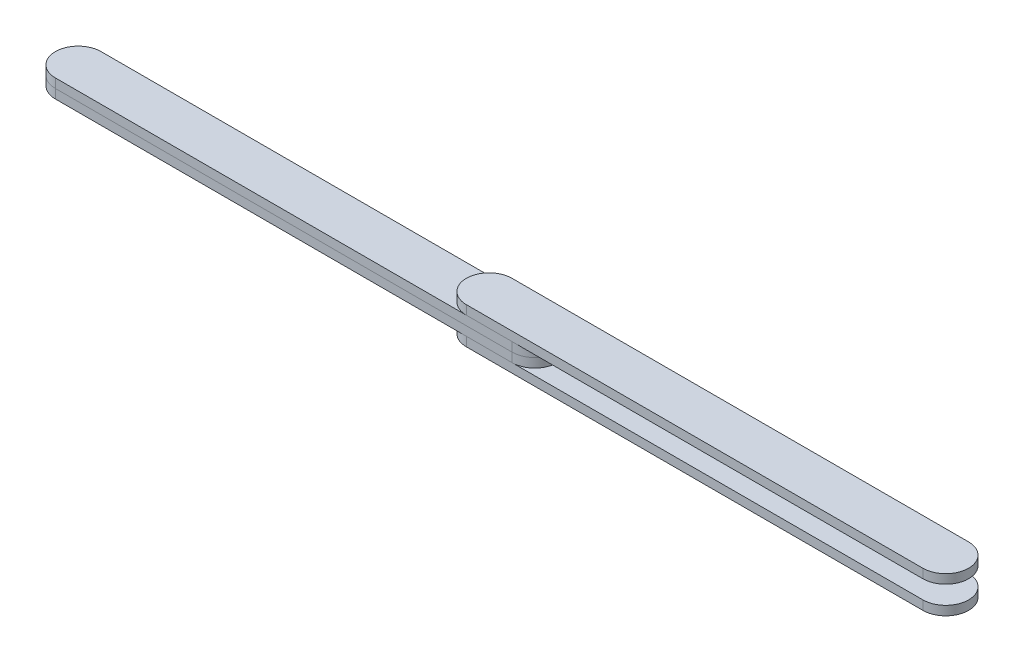
ISO-10303-21;
HEADER;
FILE_DESCRIPTION(('STEP AP214'),'2;1');
FILE_NAME('part.step','',(''),(''),'','','');
FILE_SCHEMA(('AUTOMOTIVE_DESIGN { 1 0 10303 214 1 1 1 1 }'));
ENDSEC;
DATA;
#1=APPLICATION_CONTEXT('core data for automotive mechanical design processes');
#2=APPLICATION_PROTOCOL_DEFINITION('international standard','automotive_design',2000,#1);
#3=PRODUCT_CONTEXT('',#1,'mechanical');
#4=PRODUCT('Part','Part','',(#3));
#5=PRODUCT_RELATED_PRODUCT_CATEGORY('part','',(#4));
#6=PRODUCT_DEFINITION_FORMATION('','',#4);
#7=PRODUCT_DEFINITION_CONTEXT('part definition',#1,'design');
#8=PRODUCT_DEFINITION('design','',#6,#7);
#9=PRODUCT_DEFINITION_SHAPE('','',#8);
#10=(LENGTH_UNIT() NAMED_UNIT(*) SI_UNIT(.MILLI.,.METRE.));
#11=(NAMED_UNIT(*) PLANE_ANGLE_UNIT() SI_UNIT($,.RADIAN.));
#12=(NAMED_UNIT(*) SI_UNIT($,.STERADIAN.) SOLID_ANGLE_UNIT());
#13=UNCERTAINTY_MEASURE_WITH_UNIT(LENGTH_MEASURE(1.E-05),#10,'distance_accuracy_value','');
#14=(GEOMETRIC_REPRESENTATION_CONTEXT(3) GLOBAL_UNCERTAINTY_ASSIGNED_CONTEXT((#13)) GLOBAL_UNIT_ASSIGNED_CONTEXT((#10,
#11,#12)) REPRESENTATION_CONTEXT('',''));
#15=CARTESIAN_POINT('',(0.,0.,0.));
#16=DIRECTION('',(0.,0.,1.));
#17=DIRECTION('',(1.,0.,0.));
#18=AXIS2_PLACEMENT_3D('',#15,#16,#17);
#19=CARTESIAN_POINT('',(970.077980765021,1026.37820884066,1015.54777221693));
#20=DIRECTION('',(0.,-1.,0.));
#21=DIRECTION('',(0.,0.,-1.));
#22=AXIS2_PLACEMENT_3D('',#19,#20,#21);
#23=CYLINDRICAL_SURFACE('',#22,5.);
#24=CARTESIAN_POINT('',(970.077980765021,1024.37820884066,1015.54777221693));
#25=DIRECTION('',(0.,1.,0.));
#26=DIRECTION('',(0.,0.,-1.));
#27=AXIS2_PLACEMENT_3D('',#24,#25,#26);
#28=CIRCLE('',#27,5.);
#29=CARTESIAN_POINT('',(970.077980765021,1024.37820884066,1010.54777221693));
#30=VERTEX_POINT('',#29);
#31=CARTESIAN_POINT('',(970.077980765021,1024.37820884066,1020.54777221693));
#32=VERTEX_POINT('',#31);
#33=EDGE_CURVE('P0_E79',#30,#32,#28,.T.);
#34=ORIENTED_EDGE('',*,*,#33,.T.);
#35=DIRECTION('',(0.,-1.,0.));
#36=VECTOR('',#35,1.);
#37=CARTESIAN_POINT('',(970.077980765021,1026.37820884066,1020.54777221693));
#38=LINE('',#37,#36);
#39=CARTESIAN_POINT('',(970.077980765021,1026.37820884066,1020.54777221693));
#40=VERTEX_POINT('',#39);
#41=EDGE_CURVE('P0_E10',#40,#32,#38,.T.);
#42=ORIENTED_EDGE('',*,*,#41,.F.);
#43=CARTESIAN_POINT('',(970.077980765021,1026.37820884066,1015.54777221693));
#44=DIRECTION('',(0.,1.,0.));
#45=DIRECTION('',(0.,0.,-1.));
#46=AXIS2_PLACEMENT_3D('',#43,#44,#45);
#47=CIRCLE('',#46,5.);
#48=CARTESIAN_POINT('',(970.077980765021,1026.37820884066,1010.54777221693));
#49=VERTEX_POINT('',#48);
#50=EDGE_CURVE('P0_E67',#49,#40,#47,.T.);
#51=ORIENTED_EDGE('',*,*,#50,.F.);
#52=DIRECTION('',(0.,-1.,0.));
#53=VECTOR('',#52,1.);
#54=CARTESIAN_POINT('',(970.077980765021,1026.37820884066,1010.54777221693));
#55=LINE('',#54,#53);
#56=EDGE_CURVE('P0_E75',#49,#30,#55,.T.);
#57=ORIENTED_EDGE('',*,*,#56,.T.);
#58=EDGE_LOOP('',(#34,#42,#51,#57));
#59=FACE_BOUND('',#58,.T.);
#60=ADVANCED_FACE('P0_F16',(#59),#23,.T.);
#61=CARTESIAN_POINT('',(970.077980765021,1026.37820884066,1020.54777221693));
#62=DIRECTION('',(0.,0.,-1.));
#63=DIRECTION('',(-1.,0.,0.));
#64=AXIS2_PLACEMENT_3D('',#61,#62,#63);
#65=PLANE('',#64);
#66=DIRECTION('',(1.,0.,0.));
#67=VECTOR('',#66,1.);
#68=CARTESIAN_POINT('',(970.077980765021,1024.37820884066,1020.54777221693));
#69=LINE('',#68,#67);
#70=CARTESIAN_POINT('',(1070.07798076502,1024.37820884066,1020.54777221693));
#71=VERTEX_POINT('',#70);
#72=EDGE_CURVE('P0_E71',#32,#71,#69,.T.);
#73=ORIENTED_EDGE('',*,*,#72,.T.);
#74=DIRECTION('',(0.,-1.,0.));
#75=VECTOR('',#74,1.);
#76=CARTESIAN_POINT('',(1070.07798076502,1026.37820884066,1020.54777221693));
#77=LINE('',#76,#75);
#78=CARTESIAN_POINT('',(1070.07798076502,1026.37820884066,1020.54777221693));
#79=VERTEX_POINT('',#78);
#80=EDGE_CURVE('P0_E24',#79,#71,#77,.T.);
#81=ORIENTED_EDGE('',*,*,#80,.F.);
#82=DIRECTION('',(1.,0.,0.));
#83=VECTOR('',#82,1.);
#84=CARTESIAN_POINT('',(970.077980765021,1026.37820884066,1020.54777221693));
#85=LINE('',#84,#83);
#86=EDGE_CURVE('P0_E62',#40,#79,#85,.T.);
#87=ORIENTED_EDGE('',*,*,#86,.F.);
#88=ORIENTED_EDGE('',*,*,#41,.T.);
#89=EDGE_LOOP('',(#73,#81,#87,#88));
#90=FACE_BOUND('',#89,.T.);
#91=ADVANCED_FACE('P0_F70',(#90),#65,.F.);
#92=CARTESIAN_POINT('',(1070.07798076502,1026.37820884066,1015.54777221693));
#93=DIRECTION('',(0.,-1.,0.));
#94=DIRECTION('',(0.,0.,-1.));
#95=AXIS2_PLACEMENT_3D('',#92,#93,#94);
#96=CYLINDRICAL_SURFACE('',#95,5.);
#97=CARTESIAN_POINT('',(1070.07798076502,1024.37820884066,1015.54777221693));
#98=DIRECTION('',(0.,1.,0.));
#99=DIRECTION('',(0.,0.,1.));
#100=AXIS2_PLACEMENT_3D('',#97,#98,#99);
#101=CIRCLE('',#100,5.);
#102=CARTESIAN_POINT('',(1070.07798076502,1024.37820884066,1010.54777221693));
#103=VERTEX_POINT('',#102);
#104=EDGE_CURVE('P0_E49',#71,#103,#101,.T.);
#105=ORIENTED_EDGE('',*,*,#104,.T.);
#106=DIRECTION('',(0.,-1.,0.));
#107=VECTOR('',#106,1.);
#108=CARTESIAN_POINT('',(1070.07798076502,1026.37820884066,1010.54777221693));
#109=LINE('',#108,#107);
#110=CARTESIAN_POINT('',(1070.07798076502,1026.37820884066,1010.54777221693));
#111=VERTEX_POINT('',#110);
#112=EDGE_CURVE('P0_E72',#111,#103,#109,.T.);
#113=ORIENTED_EDGE('',*,*,#112,.F.);
#114=CARTESIAN_POINT('',(1070.07798076502,1026.37820884066,1015.54777221693));
#115=DIRECTION('',(0.,1.,0.));
#116=DIRECTION('',(0.,0.,1.));
#117=AXIS2_PLACEMENT_3D('',#114,#115,#116);
#118=CIRCLE('',#117,5.);
#119=EDGE_CURVE('P0_E65',#79,#111,#118,.T.);
#120=ORIENTED_EDGE('',*,*,#119,.F.);
#121=ORIENTED_EDGE('',*,*,#80,.T.);
#122=EDGE_LOOP('',(#105,#113,#120,#121));
#123=FACE_BOUND('',#122,.T.);
#124=ADVANCED_FACE('P0_F73',(#123),#96,.T.);
#125=CARTESIAN_POINT('',(970.077980765021,1026.37820884066,1010.54777221693));
#126=DIRECTION('',(0.,0.,1.));
#127=DIRECTION('',(1.,0.,0.));
#128=AXIS2_PLACEMENT_3D('',#125,#126,#127);
#129=PLANE('',#128);
#130=DIRECTION('',(-1.,0.,0.));
#131=VECTOR('',#130,1.);
#132=CARTESIAN_POINT('',(970.077980765021,1024.37820884066,1010.54777221693));
#133=LINE('',#132,#131);
#134=EDGE_CURVE('P0_E55',#103,#30,#133,.T.);
#135=ORIENTED_EDGE('',*,*,#134,.T.);
#136=ORIENTED_EDGE('',*,*,#56,.F.);
#137=DIRECTION('',(-1.,0.,0.));
#138=VECTOR('',#137,1.);
#139=CARTESIAN_POINT('',(970.077980765021,1026.37820884066,1010.54777221693));
#140=LINE('',#139,#138);
#141=EDGE_CURVE('P0_E32',#111,#49,#140,.T.);
#142=ORIENTED_EDGE('',*,*,#141,.F.);
#143=ORIENTED_EDGE('',*,*,#112,.T.);
#144=EDGE_LOOP('',(#135,#136,#142,#143));
#145=FACE_BOUND('',#144,.T.);
#146=ADVANCED_FACE('P0_F86',(#145),#129,.F.);
#147=CARTESIAN_POINT('',(970.077980765021,1026.37820884066,1015.54777221693));
#148=DIRECTION('',(0.,-1.,0.));
#149=DIRECTION('',(0.,0.,-1.));
#150=AXIS2_PLACEMENT_3D('',#147,#148,#149);
#151=PLANE('',#150);
#152=ORIENTED_EDGE('',*,*,#50,.T.);
#153=ORIENTED_EDGE('',*,*,#86,.T.);
#154=ORIENTED_EDGE('',*,*,#119,.T.);
#155=ORIENTED_EDGE('',*,*,#141,.T.);
#156=EDGE_LOOP('',(#152,#153,#154,#155));
#157=FACE_BOUND('',#156,.T.);
#158=ADVANCED_FACE('P0_F63',(#157),#151,.F.);
#159=CARTESIAN_POINT('',(970.077980765021,1024.37820884066,1015.54777221693));
#160=DIRECTION('',(0.,-1.,0.));
#161=DIRECTION('',(0.,0.,-1.));
#162=AXIS2_PLACEMENT_3D('',#159,#160,#161);
#163=PLANE('',#162);
#164=ORIENTED_EDGE('',*,*,#33,.F.);
#165=ORIENTED_EDGE('',*,*,#134,.F.);
#166=ORIENTED_EDGE('',*,*,#104,.F.);
#167=ORIENTED_EDGE('',*,*,#72,.F.);
#168=EDGE_LOOP('',(#164,#165,#166,#167));
#169=FACE_BOUND('',#168,.T.);
#170=ADVANCED_FACE('P0_F89',(#169),#163,.T.);
#171=CLOSED_SHELL('',(#60,#91,#124,#146,#158,#170));
#172=MANIFOLD_SOLID_BREP('P0_B1',#171);
#173=CARTESIAN_POINT('',(970.077980765021,1028.37820884066,1015.54777221693));
#174=DIRECTION('',(0.,-1.,0.));
#175=DIRECTION('',(0.,0.,-1.));
#176=AXIS2_PLACEMENT_3D('',#173,#174,#175);
#177=CYLINDRICAL_SURFACE('',#176,5.);
#178=CARTESIAN_POINT('',(970.077980765021,1026.37820884066,1015.54777221693));
#179=DIRECTION('',(0.,1.,0.));
#180=DIRECTION('',(0.,0.,-1.));
#181=AXIS2_PLACEMENT_3D('',#178,#179,#180);
#182=CIRCLE('',#181,5.);
#183=CARTESIAN_POINT('',(970.077980765021,1026.37820884066,1010.54777221693));
#184=VERTEX_POINT('',#183);
#185=CARTESIAN_POINT('',(970.077980765021,1026.37820884066,1020.54777221693));
#186=VERTEX_POINT('',#185);
#187=EDGE_CURVE('P1_E80',#184,#186,#182,.T.);
#188=ORIENTED_EDGE('',*,*,#187,.T.);
#189=DIRECTION('',(0.,-1.,0.));
#190=VECTOR('',#189,1.);
#191=CARTESIAN_POINT('',(970.077980765021,1028.37820884066,1020.54777221693));
#192=LINE('',#191,#190);
#193=CARTESIAN_POINT('',(970.077980765021,1028.37820884066,1020.54777221693));
#194=VERTEX_POINT('',#193);
#195=EDGE_CURVE('P1_E11',#194,#186,#192,.T.);
#196=ORIENTED_EDGE('',*,*,#195,.F.);
#197=CARTESIAN_POINT('',(970.077980765021,1028.37820884066,1015.54777221693));
#198=DIRECTION('',(0.,1.,0.));
#199=DIRECTION('',(0.,0.,-1.));
#200=AXIS2_PLACEMENT_3D('',#197,#198,#199);
#201=CIRCLE('',#200,5.);
#202=CARTESIAN_POINT('',(970.077980765021,1028.37820884066,1010.54777221693));
#203=VERTEX_POINT('',#202);
#204=EDGE_CURVE('P1_E68',#203,#194,#201,.T.);
#205=ORIENTED_EDGE('',*,*,#204,.F.);
#206=DIRECTION('',(0.,-1.,0.));
#207=VECTOR('',#206,1.);
#208=CARTESIAN_POINT('',(970.077980765021,1028.37820884066,1010.54777221693));
#209=LINE('',#208,#207);
#210=EDGE_CURVE('P1_E76',#203,#184,#209,.T.);
#211=ORIENTED_EDGE('',*,*,#210,.T.);
#212=EDGE_LOOP('',(#188,#196,#205,#211));
#213=FACE_BOUND('',#212,.T.);
#214=ADVANCED_FACE('P1_F17',(#213),#177,.T.);
#215=CARTESIAN_POINT('',(970.077980765021,1028.37820884066,1020.54777221693));
#216=DIRECTION('',(0.,0.,-1.));
#217=DIRECTION('',(-1.,0.,0.));
#218=AXIS2_PLACEMENT_3D('',#215,#216,#217);
#219=PLANE('',#218);
#220=DIRECTION('',(1.,0.,0.));
#221=VECTOR('',#220,1.);
#222=CARTESIAN_POINT('',(970.077980765021,1026.37820884066,1020.54777221693));
#223=LINE('',#222,#221);
#224=CARTESIAN_POINT('',(1070.07798076502,1026.37820884066,1020.54777221693));
#225=VERTEX_POINT('',#224);
#226=EDGE_CURVE('P1_E72',#186,#225,#223,.T.);
#227=ORIENTED_EDGE('',*,*,#226,.T.);
#228=DIRECTION('',(0.,-1.,0.));
#229=VECTOR('',#228,1.);
#230=CARTESIAN_POINT('',(1070.07798076502,1028.37820884066,1020.54777221693));
#231=LINE('',#230,#229);
#232=CARTESIAN_POINT('',(1070.07798076502,1028.37820884066,1020.54777221693));
#233=VERTEX_POINT('',#232);
#234=EDGE_CURVE('P1_E25',#233,#225,#231,.T.);
#235=ORIENTED_EDGE('',*,*,#234,.F.);
#236=DIRECTION('',(1.,0.,0.));
#237=VECTOR('',#236,1.);
#238=CARTESIAN_POINT('',(970.077980765021,1028.37820884066,1020.54777221693));
#239=LINE('',#238,#237);
#240=EDGE_CURVE('P1_E63',#194,#233,#239,.T.);
#241=ORIENTED_EDGE('',*,*,#240,.F.);
#242=ORIENTED_EDGE('',*,*,#195,.T.);
#243=EDGE_LOOP('',(#227,#235,#241,#242));
#244=FACE_BOUND('',#243,.T.);
#245=ADVANCED_FACE('P1_F71',(#244),#219,.F.);
#246=CARTESIAN_POINT('',(1070.07798076502,1028.37820884066,1015.54777221693));
#247=DIRECTION('',(0.,-1.,0.));
#248=DIRECTION('',(0.,0.,-1.));
#249=AXIS2_PLACEMENT_3D('',#246,#247,#248);
#250=CYLINDRICAL_SURFACE('',#249,5.);
#251=CARTESIAN_POINT('',(1070.07798076502,1026.37820884066,1015.54777221693));
#252=DIRECTION('',(0.,1.,0.));
#253=DIRECTION('',(0.,0.,1.));
#254=AXIS2_PLACEMENT_3D('',#251,#252,#253);
#255=CIRCLE('',#254,5.);
#256=CARTESIAN_POINT('',(1070.07798076502,1026.37820884066,1010.54777221693));
#257=VERTEX_POINT('',#256);
#258=EDGE_CURVE('P1_E50',#225,#257,#255,.T.);
#259=ORIENTED_EDGE('',*,*,#258,.T.);
#260=DIRECTION('',(0.,-1.,0.));
#261=VECTOR('',#260,1.);
#262=CARTESIAN_POINT('',(1070.07798076502,1028.37820884066,1010.54777221693));
#263=LINE('',#262,#261);
#264=CARTESIAN_POINT('',(1070.07798076502,1028.37820884066,1010.54777221693));
#265=VERTEX_POINT('',#264);
#266=EDGE_CURVE('P1_E73',#265,#257,#263,.T.);
#267=ORIENTED_EDGE('',*,*,#266,.F.);
#268=CARTESIAN_POINT('',(1070.07798076502,1028.37820884066,1015.54777221693));
#269=DIRECTION('',(0.,1.,0.));
#270=DIRECTION('',(0.,0.,1.));
#271=AXIS2_PLACEMENT_3D('',#268,#269,#270);
#272=CIRCLE('',#271,5.);
#273=EDGE_CURVE('P1_E66',#233,#265,#272,.T.);
#274=ORIENTED_EDGE('',*,*,#273,.F.);
#275=ORIENTED_EDGE('',*,*,#234,.T.);
#276=EDGE_LOOP('',(#259,#267,#274,#275));
#277=FACE_BOUND('',#276,.T.);
#278=ADVANCED_FACE('P1_F74',(#277),#250,.T.);
#279=CARTESIAN_POINT('',(970.077980765021,1028.37820884066,1010.54777221693));
#280=DIRECTION('',(0.,0.,1.));
#281=DIRECTION('',(1.,0.,0.));
#282=AXIS2_PLACEMENT_3D('',#279,#280,#281);
#283=PLANE('',#282);
#284=DIRECTION('',(-1.,0.,0.));
#285=VECTOR('',#284,1.);
#286=CARTESIAN_POINT('',(970.077980765021,1026.37820884066,1010.54777221693));
#287=LINE('',#286,#285);
#288=EDGE_CURVE('P1_E56',#257,#184,#287,.T.);
#289=ORIENTED_EDGE('',*,*,#288,.T.);
#290=ORIENTED_EDGE('',*,*,#210,.F.);
#291=DIRECTION('',(-1.,0.,0.));
#292=VECTOR('',#291,1.);
#293=CARTESIAN_POINT('',(970.077980765021,1028.37820884066,1010.54777221693));
#294=LINE('',#293,#292);
#295=EDGE_CURVE('P1_E33',#265,#203,#294,.T.);
#296=ORIENTED_EDGE('',*,*,#295,.F.);
#297=ORIENTED_EDGE('',*,*,#266,.T.);
#298=EDGE_LOOP('',(#289,#290,#296,#297));
#299=FACE_BOUND('',#298,.T.);
#300=ADVANCED_FACE('P1_F87',(#299),#283,.F.);
#301=CARTESIAN_POINT('',(970.077980765021,1028.37820884066,1015.54777221693));
#302=DIRECTION('',(0.,-1.,0.));
#303=DIRECTION('',(0.,0.,-1.));
#304=AXIS2_PLACEMENT_3D('',#301,#302,#303);
#305=PLANE('',#304);
#306=ORIENTED_EDGE('',*,*,#204,.T.);
#307=ORIENTED_EDGE('',*,*,#240,.T.);
#308=ORIENTED_EDGE('',*,*,#273,.T.);
#309=ORIENTED_EDGE('',*,*,#295,.T.);
#310=EDGE_LOOP('',(#306,#307,#308,#309));
#311=FACE_BOUND('',#310,.T.);
#312=ADVANCED_FACE('P1_F64',(#311),#305,.F.);
#313=CARTESIAN_POINT('',(970.077980765021,1026.37820884066,1015.54777221693));
#314=DIRECTION('',(0.,-1.,0.));
#315=DIRECTION('',(0.,0.,-1.));
#316=AXIS2_PLACEMENT_3D('',#313,#314,#315);
#317=PLANE('',#316);
#318=ORIENTED_EDGE('',*,*,#187,.F.);
#319=ORIENTED_EDGE('',*,*,#288,.F.);
#320=ORIENTED_EDGE('',*,*,#258,.F.);
#321=ORIENTED_EDGE('',*,*,#226,.F.);
#322=EDGE_LOOP('',(#318,#319,#320,#321));
#323=FACE_BOUND('',#322,.T.);
#324=ADVANCED_FACE('P1_F90',(#323),#317,.T.);
#325=CLOSED_SHELL('',(#214,#245,#278,#300,#312,#324));
#326=MANIFOLD_SOLID_BREP('P1_B1',#325);
#327=CARTESIAN_POINT('',(1060.07798076502,1030.37820884066,1015.54777221693));
#328=DIRECTION('',(0.,-1.,0.));
#329=DIRECTION('',(0.,0.,-1.));
#330=AXIS2_PLACEMENT_3D('',#327,#328,#329);
#331=CYLINDRICAL_SURFACE('',#330,5.);
#332=CARTESIAN_POINT('',(1060.07798076502,1028.37820884066,1015.54777221693));
#333=DIRECTION('',(0.,1.,0.));
#334=DIRECTION('',(0.,0.,-1.));
#335=AXIS2_PLACEMENT_3D('',#332,#333,#334);
#336=CIRCLE('',#335,5.);
#337=CARTESIAN_POINT('',(1060.07798076502,1028.37820884066,1010.54777221693));
#338=VERTEX_POINT('',#337);
#339=CARTESIAN_POINT('',(1060.07798076502,1028.37820884066,1020.54777221693));
#340=VERTEX_POINT('',#339);
#341=EDGE_CURVE('P2_E80',#338,#340,#336,.T.);
#342=ORIENTED_EDGE('',*,*,#341,.T.);
#343=DIRECTION('',(0.,-1.,0.));
#344=VECTOR('',#343,1.);
#345=CARTESIAN_POINT('',(1060.07798076502,1030.37820884066,1020.54777221693));
#346=LINE('',#345,#344);
#347=CARTESIAN_POINT('',(1060.07798076502,1030.37820884066,1020.54777221693));
#348=VERTEX_POINT('',#347);
#349=EDGE_CURVE('P2_E11',#348,#340,#346,.T.);
#350=ORIENTED_EDGE('',*,*,#349,.F.);
#351=CARTESIAN_POINT('',(1060.07798076502,1030.37820884066,1015.54777221693));
#352=DIRECTION('',(0.,1.,0.));
#353=DIRECTION('',(0.,0.,-1.));
#354=AXIS2_PLACEMENT_3D('',#351,#352,#353);
#355=CIRCLE('',#354,5.);
#356=CARTESIAN_POINT('',(1060.07798076502,1030.37820884066,1010.54777221693));
#357=VERTEX_POINT('',#356);
#358=EDGE_CURVE('P2_E68',#357,#348,#355,.T.);
#359=ORIENTED_EDGE('',*,*,#358,.F.);
#360=DIRECTION('',(0.,-1.,0.));
#361=VECTOR('',#360,1.);
#362=CARTESIAN_POINT('',(1060.07798076502,1030.37820884066,1010.54777221693));
#363=LINE('',#362,#361);
#364=EDGE_CURVE('P2_E76',#357,#338,#363,.T.);
#365=ORIENTED_EDGE('',*,*,#364,.T.);
#366=EDGE_LOOP('',(#342,#350,#359,#365));
#367=FACE_BOUND('',#366,.T.);
#368=ADVANCED_FACE('P2_F17',(#367),#331,.T.);
#369=CARTESIAN_POINT('',(1060.07798076502,1030.37820884066,1020.54777221693));
#370=DIRECTION('',(0.,0.,-1.));
#371=DIRECTION('',(-1.,0.,0.));
#372=AXIS2_PLACEMENT_3D('',#369,#370,#371);
#373=PLANE('',#372);
#374=DIRECTION('',(1.,0.,0.));
#375=VECTOR('',#374,1.);
#376=CARTESIAN_POINT('',(1060.07798076502,1028.37820884066,1020.54777221693));
#377=LINE('',#376,#375);
#378=CARTESIAN_POINT('',(1160.07798076502,1028.37820884066,1020.54777221693));
#379=VERTEX_POINT('',#378);
#380=EDGE_CURVE('P2_E72',#340,#379,#377,.T.);
#381=ORIENTED_EDGE('',*,*,#380,.T.);
#382=DIRECTION('',(0.,-1.,0.));
#383=VECTOR('',#382,1.);
#384=CARTESIAN_POINT('',(1160.07798076502,1030.37820884066,1020.54777221693));
#385=LINE('',#384,#383);
#386=CARTESIAN_POINT('',(1160.07798076502,1030.37820884066,1020.54777221693));
#387=VERTEX_POINT('',#386);
#388=EDGE_CURVE('P2_E25',#387,#379,#385,.T.);
#389=ORIENTED_EDGE('',*,*,#388,.F.);
#390=DIRECTION('',(1.,0.,0.));
#391=VECTOR('',#390,1.);
#392=CARTESIAN_POINT('',(1060.07798076502,1030.37820884066,1020.54777221693));
#393=LINE('',#392,#391);
#394=EDGE_CURVE('P2_E63',#348,#387,#393,.T.);
#395=ORIENTED_EDGE('',*,*,#394,.F.);
#396=ORIENTED_EDGE('',*,*,#349,.T.);
#397=EDGE_LOOP('',(#381,#389,#395,#396));
#398=FACE_BOUND('',#397,.T.);
#399=ADVANCED_FACE('P2_F71',(#398),#373,.F.);
#400=CARTESIAN_POINT('',(1160.07798076502,1030.37820884066,1015.54777221693));
#401=DIRECTION('',(0.,-1.,0.));
#402=DIRECTION('',(0.,0.,-1.));
#403=AXIS2_PLACEMENT_3D('',#400,#401,#402);
#404=CYLINDRICAL_SURFACE('',#403,5.);
#405=CARTESIAN_POINT('',(1160.07798076502,1028.37820884066,1015.54777221693));
#406=DIRECTION('',(0.,1.,0.));
#407=DIRECTION('',(0.,0.,1.));
#408=AXIS2_PLACEMENT_3D('',#405,#406,#407);
#409=CIRCLE('',#408,5.);
#410=CARTESIAN_POINT('',(1160.07798076502,1028.37820884066,1010.54777221693));
#411=VERTEX_POINT('',#410);
#412=EDGE_CURVE('P2_E50',#379,#411,#409,.T.);
#413=ORIENTED_EDGE('',*,*,#412,.T.);
#414=DIRECTION('',(0.,-1.,0.));
#415=VECTOR('',#414,1.);
#416=CARTESIAN_POINT('',(1160.07798076502,1030.37820884066,1010.54777221693));
#417=LINE('',#416,#415);
#418=CARTESIAN_POINT('',(1160.07798076502,1030.37820884066,1010.54777221693));
#419=VERTEX_POINT('',#418);
#420=EDGE_CURVE('P2_E73',#419,#411,#417,.T.);
#421=ORIENTED_EDGE('',*,*,#420,.F.);
#422=CARTESIAN_POINT('',(1160.07798076502,1030.37820884066,1015.54777221693));
#423=DIRECTION('',(0.,1.,0.));
#424=DIRECTION('',(0.,0.,1.));
#425=AXIS2_PLACEMENT_3D('',#422,#423,#424);
#426=CIRCLE('',#425,5.);
#427=EDGE_CURVE('P2_E66',#387,#419,#426,.T.);
#428=ORIENTED_EDGE('',*,*,#427,.F.);
#429=ORIENTED_EDGE('',*,*,#388,.T.);
#430=EDGE_LOOP('',(#413,#421,#428,#429));
#431=FACE_BOUND('',#430,.T.);
#432=ADVANCED_FACE('P2_F74',(#431),#404,.T.);
#433=CARTESIAN_POINT('',(1060.07798076502,1030.37820884066,1010.54777221693));
#434=DIRECTION('',(0.,0.,1.));
#435=DIRECTION('',(1.,0.,0.));
#436=AXIS2_PLACEMENT_3D('',#433,#434,#435);
#437=PLANE('',#436);
#438=DIRECTION('',(-1.,0.,0.));
#439=VECTOR('',#438,1.);
#440=CARTESIAN_POINT('',(1060.07798076502,1028.37820884066,1010.54777221693));
#441=LINE('',#440,#439);
#442=EDGE_CURVE('P2_E56',#411,#338,#441,.T.);
#443=ORIENTED_EDGE('',*,*,#442,.T.);
#444=ORIENTED_EDGE('',*,*,#364,.F.);
#445=DIRECTION('',(-1.,0.,0.));
#446=VECTOR('',#445,1.);
#447=CARTESIAN_POINT('',(1060.07798076502,1030.37820884066,1010.54777221693));
#448=LINE('',#447,#446);
#449=EDGE_CURVE('P2_E33',#419,#357,#448,.T.);
#450=ORIENTED_EDGE('',*,*,#449,.F.);
#451=ORIENTED_EDGE('',*,*,#420,.T.);
#452=EDGE_LOOP('',(#443,#444,#450,#451));
#453=FACE_BOUND('',#452,.T.);
#454=ADVANCED_FACE('P2_F87',(#453),#437,.F.);
#455=CARTESIAN_POINT('',(1060.07798076502,1030.37820884066,1015.54777221693));
#456=DIRECTION('',(0.,-1.,0.));
#457=DIRECTION('',(0.,0.,-1.));
#458=AXIS2_PLACEMENT_3D('',#455,#456,#457);
#459=PLANE('',#458);
#460=ORIENTED_EDGE('',*,*,#358,.T.);
#461=ORIENTED_EDGE('',*,*,#394,.T.);
#462=ORIENTED_EDGE('',*,*,#427,.T.);
#463=ORIENTED_EDGE('',*,*,#449,.T.);
#464=EDGE_LOOP('',(#460,#461,#462,#463));
#465=FACE_BOUND('',#464,.T.);
#466=ADVANCED_FACE('P2_F64',(#465),#459,.F.);
#467=CARTESIAN_POINT('',(1060.07798076502,1028.37820884066,1015.54777221693));
#468=DIRECTION('',(0.,-1.,0.));
#469=DIRECTION('',(0.,0.,-1.));
#470=AXIS2_PLACEMENT_3D('',#467,#468,#469);
#471=PLANE('',#470);
#472=ORIENTED_EDGE('',*,*,#341,.F.);
#473=ORIENTED_EDGE('',*,*,#442,.F.);
#474=ORIENTED_EDGE('',*,*,#412,.F.);
#475=ORIENTED_EDGE('',*,*,#380,.F.);
#476=EDGE_LOOP('',(#472,#473,#474,#475));
#477=FACE_BOUND('',#476,.T.);
#478=ADVANCED_FACE('P2_F90',(#477),#471,.T.);
#479=CLOSED_SHELL('',(#368,#399,#432,#454,#466,#478));
#480=MANIFOLD_SOLID_BREP('P2_B1',#479);
#481=CARTESIAN_POINT('',(1060.07798076502,1024.37820884066,1015.54777221693));
#482=DIRECTION('',(0.,-1.,0.));
#483=DIRECTION('',(0.,0.,-1.));
#484=AXIS2_PLACEMENT_3D('',#481,#482,#483);
#485=CYLINDRICAL_SURFACE('',#484,5.);
#486=CARTESIAN_POINT('',(1060.07798076502,1022.37820884066,1015.54777221693));
#487=DIRECTION('',(0.,1.,0.));
#488=DIRECTION('',(0.,0.,-1.));
#489=AXIS2_PLACEMENT_3D('',#486,#487,#488);
#490=CIRCLE('',#489,5.);
#491=CARTESIAN_POINT('',(1060.07798076502,1022.37820884066,1010.54777221693));
#492=VERTEX_POINT('',#491);
#493=CARTESIAN_POINT('',(1060.07798076502,1022.37820884066,1020.54777221693));
#494=VERTEX_POINT('',#493);
#495=EDGE_CURVE('P3_E79',#492,#494,#490,.T.);
#496=ORIENTED_EDGE('',*,*,#495,.T.);
#497=DIRECTION('',(0.,-1.,0.));
#498=VECTOR('',#497,1.);
#499=CARTESIAN_POINT('',(1060.07798076502,1024.37820884066,1020.54777221693));
#500=LINE('',#499,#498);
#501=CARTESIAN_POINT('',(1060.07798076502,1024.37820884066,1020.54777221693));
#502=VERTEX_POINT('',#501);
#503=EDGE_CURVE('P3_E10',#502,#494,#500,.T.);
#504=ORIENTED_EDGE('',*,*,#503,.F.);
#505=CARTESIAN_POINT('',(1060.07798076502,1024.37820884066,1015.54777221693));
#506=DIRECTION('',(0.,1.,0.));
#507=DIRECTION('',(0.,0.,-1.));
#508=AXIS2_PLACEMENT_3D('',#505,#506,#507);
#509=CIRCLE('',#508,5.);
#510=CARTESIAN_POINT('',(1060.07798076502,1024.37820884066,1010.54777221693));
#511=VERTEX_POINT('',#510);
#512=EDGE_CURVE('P3_E67',#511,#502,#509,.T.);
#513=ORIENTED_EDGE('',*,*,#512,.F.);
#514=DIRECTION('',(0.,-1.,0.));
#515=VECTOR('',#514,1.);
#516=CARTESIAN_POINT('',(1060.07798076502,1024.37820884066,1010.54777221693));
#517=LINE('',#516,#515);
#518=EDGE_CURVE('P3_E75',#511,#492,#517,.T.);
#519=ORIENTED_EDGE('',*,*,#518,.T.);
#520=EDGE_LOOP('',(#496,#504,#513,#519));
#521=FACE_BOUND('',#520,.T.);
#522=ADVANCED_FACE('P3_F16',(#521),#485,.T.);
#523=CARTESIAN_POINT('',(1060.07798076502,1024.37820884066,1020.54777221693));
#524=DIRECTION('',(0.,0.,-1.));
#525=DIRECTION('',(-1.,0.,0.));
#526=AXIS2_PLACEMENT_3D('',#523,#524,#525);
#527=PLANE('',#526);
#528=DIRECTION('',(1.,0.,0.));
#529=VECTOR('',#528,1.);
#530=CARTESIAN_POINT('',(1060.07798076502,1022.37820884066,1020.54777221693));
#531=LINE('',#530,#529);
#532=CARTESIAN_POINT('',(1160.07798076502,1022.37820884066,1020.54777221693));
#533=VERTEX_POINT('',#532);
#534=EDGE_CURVE('P3_E71',#494,#533,#531,.T.);
#535=ORIENTED_EDGE('',*,*,#534,.T.);
#536=DIRECTION('',(0.,-1.,0.));
#537=VECTOR('',#536,1.);
#538=CARTESIAN_POINT('',(1160.07798076502,1024.37820884066,1020.54777221693));
#539=LINE('',#538,#537);
#540=CARTESIAN_POINT('',(1160.07798076502,1024.37820884066,1020.54777221693));
#541=VERTEX_POINT('',#540);
#542=EDGE_CURVE('P3_E24',#541,#533,#539,.T.);
#543=ORIENTED_EDGE('',*,*,#542,.F.);
#544=DIRECTION('',(1.,0.,0.));
#545=VECTOR('',#544,1.);
#546=CARTESIAN_POINT('',(1060.07798076502,1024.37820884066,1020.54777221693));
#547=LINE('',#546,#545);
#548=EDGE_CURVE('P3_E62',#502,#541,#547,.T.);
#549=ORIENTED_EDGE('',*,*,#548,.F.);
#550=ORIENTED_EDGE('',*,*,#503,.T.);
#551=EDGE_LOOP('',(#535,#543,#549,#550));
#552=FACE_BOUND('',#551,.T.);
#553=ADVANCED_FACE('P3_F70',(#552),#527,.F.);
#554=CARTESIAN_POINT('',(1160.07798076502,1024.37820884066,1015.54777221693));
#555=DIRECTION('',(0.,-1.,0.));
#556=DIRECTION('',(0.,0.,-1.));
#557=AXIS2_PLACEMENT_3D('',#554,#555,#556);
#558=CYLINDRICAL_SURFACE('',#557,5.);
#559=CARTESIAN_POINT('',(1160.07798076502,1022.37820884066,1015.54777221693));
#560=DIRECTION('',(0.,1.,0.));
#561=DIRECTION('',(0.,0.,1.));
#562=AXIS2_PLACEMENT_3D('',#559,#560,#561);
#563=CIRCLE('',#562,5.);
#564=CARTESIAN_POINT('',(1160.07798076502,1022.37820884066,1010.54777221693));
#565=VERTEX_POINT('',#564);
#566=EDGE_CURVE('P3_E49',#533,#565,#563,.T.);
#567=ORIENTED_EDGE('',*,*,#566,.T.);
#568=DIRECTION('',(0.,-1.,0.));
#569=VECTOR('',#568,1.);
#570=CARTESIAN_POINT('',(1160.07798076502,1024.37820884066,1010.54777221693));
#571=LINE('',#570,#569);
#572=CARTESIAN_POINT('',(1160.07798076502,1024.37820884066,1010.54777221693));
#573=VERTEX_POINT('',#572);
#574=EDGE_CURVE('P3_E72',#573,#565,#571,.T.);
#575=ORIENTED_EDGE('',*,*,#574,.F.);
#576=CARTESIAN_POINT('',(1160.07798076502,1024.37820884066,1015.54777221693));
#577=DIRECTION('',(0.,1.,0.));
#578=DIRECTION('',(0.,0.,1.));
#579=AXIS2_PLACEMENT_3D('',#576,#577,#578);
#580=CIRCLE('',#579,5.);
#581=EDGE_CURVE('P3_E65',#541,#573,#580,.T.);
#582=ORIENTED_EDGE('',*,*,#581,.F.);
#583=ORIENTED_EDGE('',*,*,#542,.T.);
#584=EDGE_LOOP('',(#567,#575,#582,#583));
#585=FACE_BOUND('',#584,.T.);
#586=ADVANCED_FACE('P3_F73',(#585),#558,.T.);
#587=CARTESIAN_POINT('',(1060.07798076502,1024.37820884066,1010.54777221693));
#588=DIRECTION('',(0.,0.,1.));
#589=DIRECTION('',(1.,0.,0.));
#590=AXIS2_PLACEMENT_3D('',#587,#588,#589);
#591=PLANE('',#590);
#592=DIRECTION('',(-1.,0.,0.));
#593=VECTOR('',#592,1.);
#594=CARTESIAN_POINT('',(1060.07798076502,1022.37820884066,1010.54777221693));
#595=LINE('',#594,#593);
#596=EDGE_CURVE('P3_E55',#565,#492,#595,.T.);
#597=ORIENTED_EDGE('',*,*,#596,.T.);
#598=ORIENTED_EDGE('',*,*,#518,.F.);
#599=DIRECTION('',(-1.,0.,0.));
#600=VECTOR('',#599,1.);
#601=CARTESIAN_POINT('',(1060.07798076502,1024.37820884066,1010.54777221693));
#602=LINE('',#601,#600);
#603=EDGE_CURVE('P3_E32',#573,#511,#602,.T.);
#604=ORIENTED_EDGE('',*,*,#603,.F.);
#605=ORIENTED_EDGE('',*,*,#574,.T.);
#606=EDGE_LOOP('',(#597,#598,#604,#605));
#607=FACE_BOUND('',#606,.T.);
#608=ADVANCED_FACE('P3_F86',(#607),#591,.F.);
#609=CARTESIAN_POINT('',(1060.07798076502,1024.37820884066,1015.54777221693));
#610=DIRECTION('',(0.,-1.,0.));
#611=DIRECTION('',(0.,0.,-1.));
#612=AXIS2_PLACEMENT_3D('',#609,#610,#611);
#613=PLANE('',#612);
#614=ORIENTED_EDGE('',*,*,#512,.T.);
#615=ORIENTED_EDGE('',*,*,#548,.T.);
#616=ORIENTED_EDGE('',*,*,#581,.T.);
#617=ORIENTED_EDGE('',*,*,#603,.T.);
#618=EDGE_LOOP('',(#614,#615,#616,#617));
#619=FACE_BOUND('',#618,.T.);
#620=ADVANCED_FACE('P3_F63',(#619),#613,.F.);
#621=CARTESIAN_POINT('',(1060.07798076502,1022.37820884066,1015.54777221693));
#622=DIRECTION('',(0.,-1.,0.));
#623=DIRECTION('',(0.,0.,-1.));
#624=AXIS2_PLACEMENT_3D('',#621,#622,#623);
#625=PLANE('',#624);
#626=ORIENTED_EDGE('',*,*,#495,.F.);
#627=ORIENTED_EDGE('',*,*,#596,.F.);
#628=ORIENTED_EDGE('',*,*,#566,.F.);
#629=ORIENTED_EDGE('',*,*,#534,.F.);
#630=EDGE_LOOP('',(#626,#627,#628,#629));
#631=FACE_BOUND('',#630,.T.);
#632=ADVANCED_FACE('P3_F89',(#631),#625,.T.);
#633=CLOSED_SHELL('',(#522,#553,#586,#608,#620,#632));
#634=MANIFOLD_SOLID_BREP('P3_B1',#633);
#635=ADVANCED_BREP_SHAPE_REPRESENTATION('',(#18,#172,#326,#480,#634),#14);
#636=SHAPE_DEFINITION_REPRESENTATION(#9,#635);
ENDSEC;
END-ISO-10303-21;
